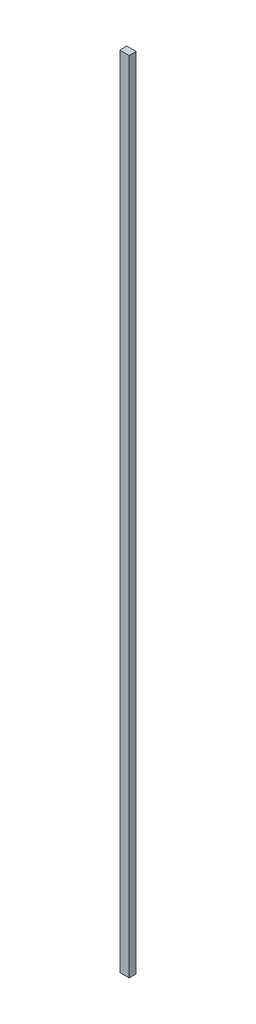
ISO-10303-21;
HEADER;
FILE_DESCRIPTION(('STEP AP214'),'2;1');
FILE_NAME('part.step','',(''),(''),'','','');
FILE_SCHEMA(('AUTOMOTIVE_DESIGN { 1 0 10303 214 1 1 1 1 }'));
ENDSEC;
DATA;
#1=APPLICATION_CONTEXT('core data for automotive mechanical design processes');
#2=APPLICATION_PROTOCOL_DEFINITION('international standard','automotive_design',2000,#1);
#3=PRODUCT_CONTEXT('',#1,'mechanical');
#4=PRODUCT('Part','Part','',(#3));
#5=PRODUCT_RELATED_PRODUCT_CATEGORY('part','',(#4));
#6=PRODUCT_DEFINITION_FORMATION('','',#4);
#7=PRODUCT_DEFINITION_CONTEXT('part definition',#1,'design');
#8=PRODUCT_DEFINITION('design','',#6,#7);
#9=PRODUCT_DEFINITION_SHAPE('','',#8);
#10=(LENGTH_UNIT() NAMED_UNIT(*) SI_UNIT(.MILLI.,.METRE.));
#11=(NAMED_UNIT(*) PLANE_ANGLE_UNIT() SI_UNIT($,.RADIAN.));
#12=(NAMED_UNIT(*) SI_UNIT($,.STERADIAN.) SOLID_ANGLE_UNIT());
#13=UNCERTAINTY_MEASURE_WITH_UNIT(LENGTH_MEASURE(1.E-05),#10,'distance_accuracy_value','');
#14=(GEOMETRIC_REPRESENTATION_CONTEXT(3) GLOBAL_UNCERTAINTY_ASSIGNED_CONTEXT((#13)) GLOBAL_UNIT_ASSIGNED_CONTEXT((#10,
#11,#12)) REPRESENTATION_CONTEXT('',''));
#15=CARTESIAN_POINT('',(0.,0.,0.));
#16=DIRECTION('',(0.,0.,1.));
#17=DIRECTION('',(1.,0.,0.));
#18=AXIS2_PLACEMENT_3D('',#15,#16,#17);
#19=CARTESIAN_POINT('',(20.,3400.,15.));
#20=DIRECTION('',(-1.,0.,0.));
#21=DIRECTION('',(0.,0.,1.));
#22=AXIS2_PLACEMENT_3D('',#19,#20,#21);
#23=PLANE('',#22);
#24=DIRECTION('',(0.,0.,-1.));
#25=VECTOR('',#24,1.);
#26=CARTESIAN_POINT('',(20.,0.,15.));
#27=LINE('',#26,#25);
#28=CARTESIAN_POINT('',(20.,0.,15.));
#29=VERTEX_POINT('',#28);
#30=CARTESIAN_POINT('',(20.,0.,-15.));
#31=VERTEX_POINT('',#30);
#32=EDGE_CURVE('E80',#29,#31,#27,.T.);
#33=ORIENTED_EDGE('',*,*,#32,.T.);
#34=DIRECTION('',(0.,-1.,0.));
#35=VECTOR('',#34,1.);
#36=CARTESIAN_POINT('',(20.,3400.,-15.));
#37=LINE('',#36,#35);
#38=CARTESIAN_POINT('',(20.,3400.,-15.));
#39=VERTEX_POINT('',#38);
#40=EDGE_CURVE('E11',#39,#31,#37,.T.);
#41=ORIENTED_EDGE('',*,*,#40,.F.);
#42=DIRECTION('',(0.,0.,-1.));
#43=VECTOR('',#42,1.);
#44=CARTESIAN_POINT('',(20.,3400.,15.));
#45=LINE('',#44,#43);
#46=CARTESIAN_POINT('',(20.,3400.,15.));
#47=VERTEX_POINT('',#46);
#48=EDGE_CURVE('E68',#47,#39,#45,.T.);
#49=ORIENTED_EDGE('',*,*,#48,.F.);
#50=DIRECTION('',(0.,-1.,0.));
#51=VECTOR('',#50,1.);
#52=CARTESIAN_POINT('',(20.,3400.,15.));
#53=LINE('',#52,#51);
#54=EDGE_CURVE('E76',#47,#29,#53,.T.);
#55=ORIENTED_EDGE('',*,*,#54,.T.);
#56=EDGE_LOOP('',(#33,#41,#49,#55));
#57=FACE_BOUND('',#56,.T.);
#58=ADVANCED_FACE('F17',(#57),#23,.F.);
#59=CARTESIAN_POINT('',(-20.,3400.,-15.));
#60=DIRECTION('',(0.,0.,1.));
#61=DIRECTION('',(1.,0.,0.));
#62=AXIS2_PLACEMENT_3D('',#59,#60,#61);
#63=PLANE('',#62);
#64=DIRECTION('',(-1.,0.,0.));
#65=VECTOR('',#64,1.);
#66=CARTESIAN_POINT('',(-20.,0.,-15.));
#67=LINE('',#66,#65);
#68=CARTESIAN_POINT('',(-20.,0.,-15.));
#69=VERTEX_POINT('',#68);
#70=EDGE_CURVE('E72',#31,#69,#67,.T.);
#71=ORIENTED_EDGE('',*,*,#70,.T.);
#72=DIRECTION('',(0.,-1.,0.));
#73=VECTOR('',#72,1.);
#74=CARTESIAN_POINT('',(-20.,3400.,-15.));
#75=LINE('',#74,#73);
#76=CARTESIAN_POINT('',(-20.,3400.,-15.));
#77=VERTEX_POINT('',#76);
#78=EDGE_CURVE('E25',#77,#69,#75,.T.);
#79=ORIENTED_EDGE('',*,*,#78,.F.);
#80=DIRECTION('',(-1.,0.,0.));
#81=VECTOR('',#80,1.);
#82=CARTESIAN_POINT('',(-20.,3400.,-15.));
#83=LINE('',#82,#81);
#84=EDGE_CURVE('E63',#39,#77,#83,.T.);
#85=ORIENTED_EDGE('',*,*,#84,.F.);
#86=ORIENTED_EDGE('',*,*,#40,.T.);
#87=EDGE_LOOP('',(#71,#79,#85,#86));
#88=FACE_BOUND('',#87,.T.);
#89=ADVANCED_FACE('F71',(#88),#63,.F.);
#90=CARTESIAN_POINT('',(-20.,3400.,15.));
#91=DIRECTION('',(1.,0.,0.));
#92=DIRECTION('',(0.,0.,-1.));
#93=AXIS2_PLACEMENT_3D('',#90,#91,#92);
#94=PLANE('',#93);
#95=DIRECTION('',(0.,0.,1.));
#96=VECTOR('',#95,1.);
#97=CARTESIAN_POINT('',(-20.,0.,15.));
#98=LINE('',#97,#96);
#99=CARTESIAN_POINT('',(-20.,0.,15.));
#100=VERTEX_POINT('',#99);
#101=EDGE_CURVE('E50',#69,#100,#98,.T.);
#102=ORIENTED_EDGE('',*,*,#101,.T.);
#103=DIRECTION('',(0.,-1.,0.));
#104=VECTOR('',#103,1.);
#105=CARTESIAN_POINT('',(-20.,3400.,15.));
#106=LINE('',#105,#104);
#107=CARTESIAN_POINT('',(-20.,3400.,15.));
#108=VERTEX_POINT('',#107);
#109=EDGE_CURVE('E73',#108,#100,#106,.T.);
#110=ORIENTED_EDGE('',*,*,#109,.F.);
#111=DIRECTION('',(0.,0.,1.));
#112=VECTOR('',#111,1.);
#113=CARTESIAN_POINT('',(-20.,3400.,15.));
#114=LINE('',#113,#112);
#115=EDGE_CURVE('E66',#77,#108,#114,.T.);
#116=ORIENTED_EDGE('',*,*,#115,.F.);
#117=ORIENTED_EDGE('',*,*,#78,.T.);
#118=EDGE_LOOP('',(#102,#110,#116,#117));
#119=FACE_BOUND('',#118,.T.);
#120=ADVANCED_FACE('F74',(#119),#94,.F.);
#121=CARTESIAN_POINT('',(-20.,3400.,15.));
#122=DIRECTION('',(0.,0.,-1.));
#123=DIRECTION('',(-1.,0.,0.));
#124=AXIS2_PLACEMENT_3D('',#121,#122,#123);
#125=PLANE('',#124);
#126=DIRECTION('',(1.,0.,0.));
#127=VECTOR('',#126,1.);
#128=CARTESIAN_POINT('',(-20.,0.,15.));
#129=LINE('',#128,#127);
#130=EDGE_CURVE('E56',#100,#29,#129,.T.);
#131=ORIENTED_EDGE('',*,*,#130,.T.);
#132=ORIENTED_EDGE('',*,*,#54,.F.);
#133=DIRECTION('',(1.,0.,0.));
#134=VECTOR('',#133,1.);
#135=CARTESIAN_POINT('',(-20.,3400.,15.));
#136=LINE('',#135,#134);
#137=EDGE_CURVE('E33',#108,#47,#136,.T.);
#138=ORIENTED_EDGE('',*,*,#137,.F.);
#139=ORIENTED_EDGE('',*,*,#109,.T.);
#140=EDGE_LOOP('',(#131,#132,#138,#139));
#141=FACE_BOUND('',#140,.T.);
#142=ADVANCED_FACE('F87',(#141),#125,.F.);
#143=CARTESIAN_POINT('',(0.,3400.,0.));
#144=DIRECTION('',(0.,-1.,0.));
#145=DIRECTION('',(0.,0.,-1.));
#146=AXIS2_PLACEMENT_3D('',#143,#144,#145);
#147=PLANE('',#146);
#148=ORIENTED_EDGE('',*,*,#48,.T.);
#149=ORIENTED_EDGE('',*,*,#84,.T.);
#150=ORIENTED_EDGE('',*,*,#115,.T.);
#151=ORIENTED_EDGE('',*,*,#137,.T.);
#152=EDGE_LOOP('',(#148,#149,#150,#151));
#153=FACE_BOUND('',#152,.T.);
#154=ADVANCED_FACE('F64',(#153),#147,.F.);
#155=CARTESIAN_POINT('',(0.,0.,0.));
#156=DIRECTION('',(0.,-1.,0.));
#157=DIRECTION('',(0.,0.,-1.));
#158=AXIS2_PLACEMENT_3D('',#155,#156,#157);
#159=PLANE('',#158);
#160=ORIENTED_EDGE('',*,*,#32,.F.);
#161=ORIENTED_EDGE('',*,*,#130,.F.);
#162=ORIENTED_EDGE('',*,*,#101,.F.);
#163=ORIENTED_EDGE('',*,*,#70,.F.);
#164=EDGE_LOOP('',(#160,#161,#162,#163));
#165=FACE_BOUND('',#164,.T.);
#166=ADVANCED_FACE('F90',(#165),#159,.T.);
#167=CLOSED_SHELL('',(#58,#89,#120,#142,#154,#166));
#168=MANIFOLD_SOLID_BREP('B1',#167);
#169=ADVANCED_BREP_SHAPE_REPRESENTATION('',(#18,#168),#14);
#170=SHAPE_DEFINITION_REPRESENTATION(#9,#169);
ENDSEC;
END-ISO-10303-21;
